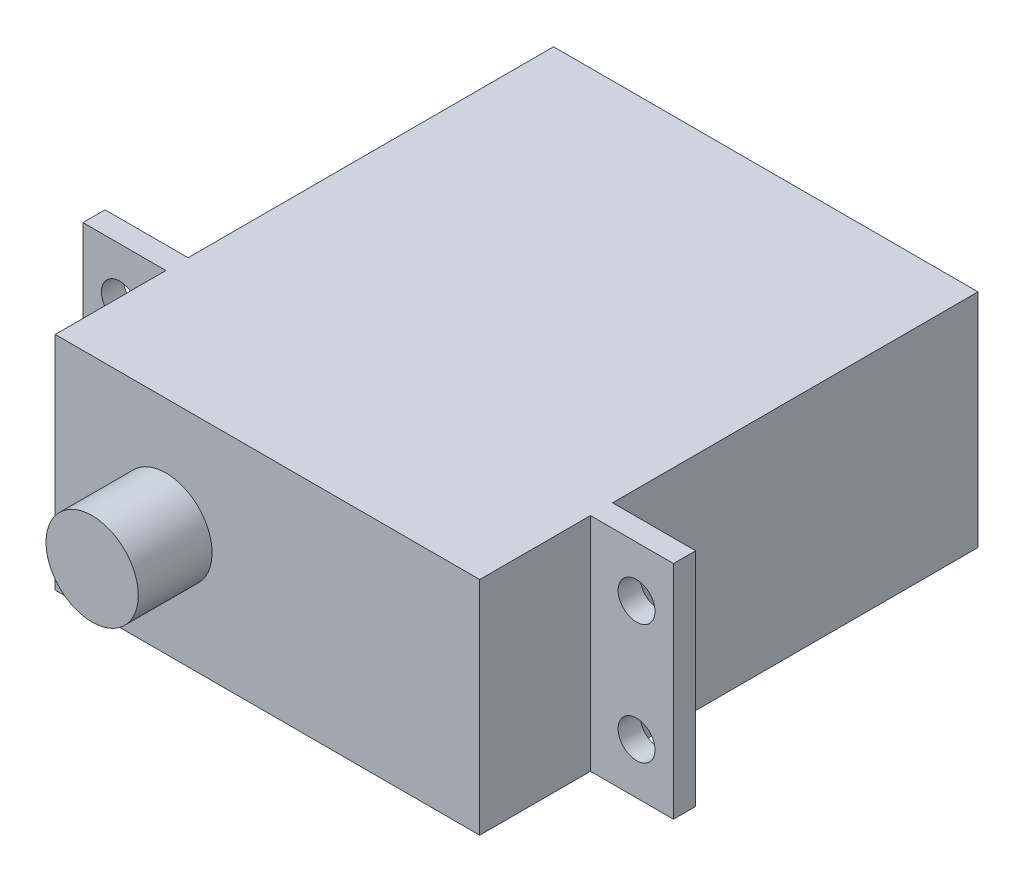
ISO-10303-21;
HEADER;
FILE_DESCRIPTION(('STEP AP214'),'2;1');
FILE_NAME('part.step','',(''),(''),'','','');
FILE_SCHEMA(('AUTOMOTIVE_DESIGN { 1 0 10303 214 1 1 1 1 }'));
ENDSEC;
DATA;
#1=APPLICATION_CONTEXT('core data for automotive mechanical design processes');
#2=APPLICATION_PROTOCOL_DEFINITION('international standard','automotive_design',2000,#1);
#3=PRODUCT_CONTEXT('',#1,'mechanical');
#4=PRODUCT('Part','Part','',(#3));
#5=PRODUCT_RELATED_PRODUCT_CATEGORY('part','',(#4));
#6=PRODUCT_DEFINITION_FORMATION('','',#4);
#7=PRODUCT_DEFINITION_CONTEXT('part definition',#1,'design');
#8=PRODUCT_DEFINITION('design','',#6,#7);
#9=PRODUCT_DEFINITION_SHAPE('','',#8);
#10=(LENGTH_UNIT() NAMED_UNIT(*) SI_UNIT(.MILLI.,.METRE.));
#11=(NAMED_UNIT(*) PLANE_ANGLE_UNIT() SI_UNIT($,.RADIAN.));
#12=(NAMED_UNIT(*) SI_UNIT($,.STERADIAN.) SOLID_ANGLE_UNIT());
#13=UNCERTAINTY_MEASURE_WITH_UNIT(LENGTH_MEASURE(1.E-05),#10,'distance_accuracy_value','');
#14=(GEOMETRIC_REPRESENTATION_CONTEXT(3) GLOBAL_UNCERTAINTY_ASSIGNED_CONTEXT((#13)) GLOBAL_UNIT_ASSIGNED_CONTEXT((#10,
#11,#12)) REPRESENTATION_CONTEXT('',''));
#15=CARTESIAN_POINT('',(0.,0.,0.));
#16=DIRECTION('',(0.,0.,1.));
#17=DIRECTION('',(1.,0.,0.));
#18=AXIS2_PLACEMENT_3D('',#15,#16,#17);
#19=CARTESIAN_POINT('',(11.5,-6.,27.));
#20=DIRECTION('',(-1.,0.,0.));
#21=DIRECTION('',(0.,-1.,0.));
#22=AXIS2_PLACEMENT_3D('',#19,#20,#21);
#23=PLANE('',#22);
#24=DIRECTION('',(0.,1.,0.));
#25=VECTOR('',#24,1.);
#26=CARTESIAN_POINT('',(11.5,-6.,19.8));
#27=LINE('',#26,#25);
#28=CARTESIAN_POINT('',(11.5,-6.,19.8));
#29=VERTEX_POINT('',#28);
#30=CARTESIAN_POINT('',(11.5,6.,19.8));
#31=VERTEX_POINT('',#30);
#32=EDGE_CURVE('E145',#29,#31,#27,.T.);
#33=ORIENTED_EDGE('',*,*,#32,.F.);
#34=DIRECTION('',(0.,0.,-1.));
#35=VECTOR('',#34,1.);
#36=CARTESIAN_POINT('',(11.5,-6.,27.));
#37=LINE('',#36,#35);
#38=CARTESIAN_POINT('',(11.5,-6.,0.));
#39=VERTEX_POINT('',#38);
#40=EDGE_CURVE('E194',#29,#39,#37,.T.);
#41=ORIENTED_EDGE('',*,*,#40,.T.);
#42=DIRECTION('',(0.,1.,0.));
#43=VECTOR('',#42,1.);
#44=CARTESIAN_POINT('',(11.5,-6.,0.));
#45=LINE('',#44,#43);
#46=CARTESIAN_POINT('',(11.5,6.,0.));
#47=VERTEX_POINT('',#46);
#48=EDGE_CURVE('E183',#39,#47,#45,.T.);
#49=ORIENTED_EDGE('',*,*,#48,.T.);
#50=DIRECTION('',(0.,0.,-1.));
#51=VECTOR('',#50,1.);
#52=CARTESIAN_POINT('',(11.5,6.,27.));
#53=LINE('',#52,#51);
#54=EDGE_CURVE('E216',#31,#47,#53,.T.);
#55=ORIENTED_EDGE('',*,*,#54,.F.);
#56=EDGE_LOOP('',(#33,#41,#49,#55));
#57=FACE_BOUND('',#56,.T.);
#58=ADVANCED_FACE('F36',(#57),#23,.F.);
#59=CARTESIAN_POINT('',(-11.5,-6.,27.));
#60=DIRECTION('',(1.,0.,0.));
#61=DIRECTION('',(0.,0.,-1.));
#62=AXIS2_PLACEMENT_3D('',#59,#60,#61);
#63=PLANE('',#62);
#64=DIRECTION('',(0.,-1.,0.));
#65=VECTOR('',#64,1.);
#66=CARTESIAN_POINT('',(-11.5,-6.,19.8));
#67=LINE('',#66,#65);
#68=CARTESIAN_POINT('',(-11.5,6.,19.8));
#69=VERTEX_POINT('',#68);
#70=CARTESIAN_POINT('',(-11.5,-6.,19.8));
#71=VERTEX_POINT('',#70);
#72=EDGE_CURVE('E180',#69,#71,#67,.T.);
#73=ORIENTED_EDGE('',*,*,#72,.F.);
#74=DIRECTION('',(0.,0.,-1.));
#75=VECTOR('',#74,1.);
#76=CARTESIAN_POINT('',(-11.5,6.,27.));
#77=LINE('',#76,#75);
#78=CARTESIAN_POINT('',(-11.5,6.,0.));
#79=VERTEX_POINT('',#78);
#80=EDGE_CURVE('E212',#69,#79,#77,.T.);
#81=ORIENTED_EDGE('',*,*,#80,.T.);
#82=DIRECTION('',(0.,-1.,0.));
#83=VECTOR('',#82,1.);
#84=CARTESIAN_POINT('',(-11.5,-6.,0.));
#85=LINE('',#84,#83);
#86=CARTESIAN_POINT('',(-11.5,-6.,0.));
#87=VERTEX_POINT('',#86);
#88=EDGE_CURVE('E200',#79,#87,#85,.T.);
#89=ORIENTED_EDGE('',*,*,#88,.T.);
#90=DIRECTION('',(0.,0.,-1.));
#91=VECTOR('',#90,1.);
#92=CARTESIAN_POINT('',(-11.5,-6.,27.));
#93=LINE('',#92,#91);
#94=EDGE_CURVE('E208',#71,#87,#93,.T.);
#95=ORIENTED_EDGE('',*,*,#94,.F.);
#96=EDGE_LOOP('',(#73,#81,#89,#95));
#97=FACE_BOUND('',#96,.T.);
#98=ADVANCED_FACE('F279',(#97),#63,.F.);
#99=CARTESIAN_POINT('',(11.5,-6.,27.));
#100=VERTEX_POINT('',#99);
#101=CARTESIAN_POINT('',(11.5,-6.,21.));
#102=VERTEX_POINT('',#101);
#103=EDGE_CURVE('E205',#100,#102,#37,.T.);
#104=ORIENTED_EDGE('',*,*,#103,.T.);
#105=DIRECTION('',(0.,1.,0.));
#106=VECTOR('',#105,1.);
#107=CARTESIAN_POINT('',(11.5,-6.,21.));
#108=LINE('',#107,#106);
#109=CARTESIAN_POINT('',(11.5,6.,21.));
#110=VERTEX_POINT('',#109);
#111=EDGE_CURVE('E178',#102,#110,#108,.T.);
#112=ORIENTED_EDGE('',*,*,#111,.T.);
#113=CARTESIAN_POINT('',(11.5,6.,27.));
#114=VERTEX_POINT('',#113);
#115=EDGE_CURVE('E45',#114,#110,#53,.T.);
#116=ORIENTED_EDGE('',*,*,#115,.F.);
#117=DIRECTION('',(0.,1.,0.));
#118=VECTOR('',#117,1.);
#119=CARTESIAN_POINT('',(11.5,-6.,27.));
#120=LINE('',#119,#118);
#121=EDGE_CURVE('E184',#100,#114,#120,.T.);
#122=ORIENTED_EDGE('',*,*,#121,.F.);
#123=EDGE_LOOP('',(#104,#112,#116,#122));
#124=FACE_BOUND('',#123,.T.);
#125=ADVANCED_FACE('F38',(#124),#23,.F.);
#126=CARTESIAN_POINT('',(-11.5,6.,27.));
#127=DIRECTION('',(0.,-1.,0.));
#128=DIRECTION('',(0.,0.,-1.));
#129=AXIS2_PLACEMENT_3D('',#126,#127,#128);
#130=PLANE('',#129);
#131=ORIENTED_EDGE('',*,*,#115,.T.);
#132=DIRECTION('',(-1.,0.,0.));
#133=VECTOR('',#132,1.);
#134=CARTESIAN_POINT('',(-16.,6.,21.));
#135=LINE('',#134,#133);
#136=CARTESIAN_POINT('',(16.,6.,21.));
#137=VERTEX_POINT('',#136);
#138=EDGE_CURVE('E53',#137,#110,#135,.T.);
#139=ORIENTED_EDGE('',*,*,#138,.F.);
#140=DIRECTION('',(0.,0.,1.));
#141=VECTOR('',#140,1.);
#142=CARTESIAN_POINT('',(16.,6.,19.8));
#143=LINE('',#142,#141);
#144=CARTESIAN_POINT('',(16.,6.,19.8));
#145=VERTEX_POINT('',#144);
#146=EDGE_CURVE('E128',#145,#137,#143,.T.);
#147=ORIENTED_EDGE('',*,*,#146,.F.);
#148=DIRECTION('',(-1.,0.,0.));
#149=VECTOR('',#148,1.);
#150=CARTESIAN_POINT('',(-16.,6.,19.8));
#151=LINE('',#150,#149);
#152=EDGE_CURVE('E132',#145,#31,#151,.T.);
#153=ORIENTED_EDGE('',*,*,#152,.T.);
#154=ORIENTED_EDGE('',*,*,#54,.T.);
#155=DIRECTION('',(-1.,0.,0.));
#156=VECTOR('',#155,1.);
#157=CARTESIAN_POINT('',(-11.5,6.,0.));
#158=LINE('',#157,#156);
#159=EDGE_CURVE('E197',#47,#79,#158,.T.);
#160=ORIENTED_EDGE('',*,*,#159,.T.);
#161=ORIENTED_EDGE('',*,*,#80,.F.);
#162=CARTESIAN_POINT('',(-16.,6.,19.8));
#163=VERTEX_POINT('',#162);
#164=EDGE_CURVE('E147',#69,#163,#151,.T.);
#165=ORIENTED_EDGE('',*,*,#164,.T.);
#166=DIRECTION('',(0.,0.,1.));
#167=VECTOR('',#166,1.);
#168=CARTESIAN_POINT('',(-16.,6.,19.8));
#169=LINE('',#168,#167);
#170=CARTESIAN_POINT('',(-16.,6.,21.));
#171=VERTEX_POINT('',#170);
#172=EDGE_CURVE('E137',#163,#171,#169,.T.);
#173=ORIENTED_EDGE('',*,*,#172,.T.);
#174=CARTESIAN_POINT('',(-11.5,6.,21.));
#175=VERTEX_POINT('',#174);
#176=EDGE_CURVE('E167',#175,#171,#135,.T.);
#177=ORIENTED_EDGE('',*,*,#176,.F.);
#178=CARTESIAN_POINT('',(-11.5,6.,27.));
#179=VERTEX_POINT('',#178);
#180=EDGE_CURVE('E213',#179,#175,#77,.T.);
#181=ORIENTED_EDGE('',*,*,#180,.F.);
#182=DIRECTION('',(-1.,0.,0.));
#183=VECTOR('',#182,1.);
#184=CARTESIAN_POINT('',(-11.5,6.,27.));
#185=LINE('',#184,#183);
#186=EDGE_CURVE('E187',#114,#179,#185,.T.);
#187=ORIENTED_EDGE('',*,*,#186,.F.);
#188=EDGE_LOOP('',(#131,#139,#147,#153,#154,#160,#161,#165,#173,#177,#181,#187));
#189=FACE_BOUND('',#188,.T.);
#190=ADVANCED_FACE('F131',(#189),#130,.F.);
#191=ORIENTED_EDGE('',*,*,#180,.T.);
#192=DIRECTION('',(0.,-1.,0.));
#193=VECTOR('',#192,1.);
#194=CARTESIAN_POINT('',(-11.5,-6.,21.));
#195=LINE('',#194,#193);
#196=CARTESIAN_POINT('',(-11.5,-6.,21.));
#197=VERTEX_POINT('',#196);
#198=EDGE_CURVE('E172',#175,#197,#195,.T.);
#199=ORIENTED_EDGE('',*,*,#198,.T.);
#200=CARTESIAN_POINT('',(-11.5,-6.,27.));
#201=VERTEX_POINT('',#200);
#202=EDGE_CURVE('E209',#201,#197,#93,.T.);
#203=ORIENTED_EDGE('',*,*,#202,.F.);
#204=DIRECTION('',(0.,-1.,0.));
#205=VECTOR('',#204,1.);
#206=CARTESIAN_POINT('',(-11.5,-6.,27.));
#207=LINE('',#206,#205);
#208=EDGE_CURVE('E190',#179,#201,#207,.T.);
#209=ORIENTED_EDGE('',*,*,#208,.F.);
#210=EDGE_LOOP('',(#191,#199,#203,#209));
#211=FACE_BOUND('',#210,.T.);
#212=ADVANCED_FACE('F266',(#211),#63,.F.);
#213=CARTESIAN_POINT('',(-11.5,-6.,27.));
#214=DIRECTION('',(0.,1.,0.));
#215=DIRECTION('',(0.,0.,1.));
#216=AXIS2_PLACEMENT_3D('',#213,#214,#215);
#217=PLANE('',#216);
#218=ORIENTED_EDGE('',*,*,#202,.T.);
#219=DIRECTION('',(1.,0.,0.));
#220=VECTOR('',#219,1.);
#221=CARTESIAN_POINT('',(-16.,-6.,21.));
#222=LINE('',#221,#220);
#223=CARTESIAN_POINT('',(-16.,-6.,21.));
#224=VERTEX_POINT('',#223);
#225=EDGE_CURVE('E61',#224,#197,#222,.T.);
#226=ORIENTED_EDGE('',*,*,#225,.F.);
#227=DIRECTION('',(0.,0.,1.));
#228=VECTOR('',#227,1.);
#229=CARTESIAN_POINT('',(-16.,-6.,19.8));
#230=LINE('',#229,#228);
#231=CARTESIAN_POINT('',(-16.,-6.,19.8));
#232=VERTEX_POINT('',#231);
#233=EDGE_CURVE('E173',#232,#224,#230,.T.);
#234=ORIENTED_EDGE('',*,*,#233,.F.);
#235=DIRECTION('',(1.,0.,0.));
#236=VECTOR('',#235,1.);
#237=CARTESIAN_POINT('',(-16.,-6.,19.8));
#238=LINE('',#237,#236);
#239=EDGE_CURVE('E138',#232,#71,#238,.T.);
#240=ORIENTED_EDGE('',*,*,#239,.T.);
#241=ORIENTED_EDGE('',*,*,#94,.T.);
#242=DIRECTION('',(1.,0.,0.));
#243=VECTOR('',#242,1.);
#244=CARTESIAN_POINT('',(-11.5,-6.,0.));
#245=LINE('',#244,#243);
#246=EDGE_CURVE('E188',#87,#39,#245,.T.);
#247=ORIENTED_EDGE('',*,*,#246,.T.);
#248=ORIENTED_EDGE('',*,*,#40,.F.);
#249=CARTESIAN_POINT('',(16.,-6.,19.8));
#250=VERTEX_POINT('',#249);
#251=EDGE_CURVE('E162',#29,#250,#238,.T.);
#252=ORIENTED_EDGE('',*,*,#251,.T.);
#253=DIRECTION('',(0.,0.,1.));
#254=VECTOR('',#253,1.);
#255=CARTESIAN_POINT('',(16.,-6.,19.8));
#256=LINE('',#255,#254);
#257=CARTESIAN_POINT('',(16.,-6.,21.));
#258=VERTEX_POINT('',#257);
#259=EDGE_CURVE('E152',#250,#258,#256,.T.);
#260=ORIENTED_EDGE('',*,*,#259,.T.);
#261=EDGE_CURVE('E154',#102,#258,#222,.T.);
#262=ORIENTED_EDGE('',*,*,#261,.F.);
#263=ORIENTED_EDGE('',*,*,#103,.F.);
#264=DIRECTION('',(1.,0.,0.));
#265=VECTOR('',#264,1.);
#266=CARTESIAN_POINT('',(-11.5,-6.,27.));
#267=LINE('',#266,#265);
#268=EDGE_CURVE('E192',#201,#100,#267,.T.);
#269=ORIENTED_EDGE('',*,*,#268,.F.);
#270=EDGE_LOOP('',(#218,#226,#234,#240,#241,#247,#248,#252,#260,#262,#263,#269));
#271=FACE_BOUND('',#270,.T.);
#272=ADVANCED_FACE('F257',(#271),#217,.F.);
#273=CARTESIAN_POINT('',(0.,0.,27.));
#274=DIRECTION('',(0.,0.,-1.));
#275=DIRECTION('',(-1.,0.,0.));
#276=AXIS2_PLACEMENT_3D('',#273,#274,#275);
#277=PLANE('',#276);
#278=CARTESIAN_POINT('',(-5.5,0.,27.));
#279=DIRECTION('',(0.,0.,-1.));
#280=DIRECTION('',(-1.,0.,0.));
#281=AXIS2_PLACEMENT_3D('',#278,#279,#280);
#282=CIRCLE('',#281,2.5);
#283=CARTESIAN_POINT('',(-8.,0.,27.));
#284=VERTEX_POINT('',#283);
#285=EDGE_CURVE('E11',#284,#284,#282,.F.);
#286=ORIENTED_EDGE('',*,*,#285,.F.);
#287=EDGE_LOOP('',(#286));
#288=FACE_BOUND('',#287,.T.);
#289=ORIENTED_EDGE('',*,*,#121,.T.);
#290=ORIENTED_EDGE('',*,*,#186,.T.);
#291=ORIENTED_EDGE('',*,*,#208,.T.);
#292=ORIENTED_EDGE('',*,*,#268,.T.);
#293=EDGE_LOOP('',(#289,#290,#291,#292));
#294=FACE_BOUND('',#293,.T.);
#295=ADVANCED_FACE('F261',(#288,#294),#277,.F.);
#296=CARTESIAN_POINT('',(0.,0.,0.));
#297=DIRECTION('',(0.,0.,-1.));
#298=DIRECTION('',(-1.,0.,0.));
#299=AXIS2_PLACEMENT_3D('',#296,#297,#298);
#300=PLANE('',#299);
#301=ORIENTED_EDGE('',*,*,#48,.F.);
#302=ORIENTED_EDGE('',*,*,#246,.F.);
#303=ORIENTED_EDGE('',*,*,#88,.F.);
#304=ORIENTED_EDGE('',*,*,#159,.F.);
#305=EDGE_LOOP('',(#301,#302,#303,#304));
#306=FACE_BOUND('',#305,.T.);
#307=ADVANCED_FACE('F285',(#306),#300,.T.);
#308=CARTESIAN_POINT('',(-16.,6.,19.8));
#309=DIRECTION('',(-1.,0.,0.));
#310=DIRECTION('',(0.,0.,1.));
#311=AXIS2_PLACEMENT_3D('',#308,#309,#310);
#312=PLANE('',#311);
#313=DIRECTION('',(0.,-1.,0.));
#314=VECTOR('',#313,1.);
#315=CARTESIAN_POINT('',(-16.,6.,21.));
#316=LINE('',#315,#314);
#317=EDGE_CURVE('E169',#171,#224,#316,.T.);
#318=ORIENTED_EDGE('',*,*,#317,.F.);
#319=ORIENTED_EDGE('',*,*,#172,.F.);
#320=DIRECTION('',(0.,-1.,0.));
#321=VECTOR('',#320,1.);
#322=CARTESIAN_POINT('',(-16.,6.,19.8));
#323=LINE('',#322,#321);
#324=EDGE_CURVE('E146',#163,#232,#323,.T.);
#325=ORIENTED_EDGE('',*,*,#324,.T.);
#326=ORIENTED_EDGE('',*,*,#233,.T.);
#327=EDGE_LOOP('',(#318,#319,#325,#326));
#328=FACE_BOUND('',#327,.T.);
#329=ADVANCED_FACE('F273',(#328),#312,.T.);
#330=CARTESIAN_POINT('',(0.,0.,21.));
#331=DIRECTION('',(0.,0.,1.));
#332=DIRECTION('',(1.,0.,0.));
#333=AXIS2_PLACEMENT_3D('',#330,#331,#332);
#334=PLANE('',#333);
#335=CARTESIAN_POINT('',(-14.,3.25,21.));
#336=DIRECTION('',(0.,0.,1.));
#337=DIRECTION('',(-1.,0.,0.));
#338=AXIS2_PLACEMENT_3D('',#335,#336,#337);
#339=CIRCLE('',#338,1.);
#340=CARTESIAN_POINT('',(-15.,3.25,21.));
#341=VERTEX_POINT('',#340);
#342=EDGE_CURVE('E234',#341,#341,#339,.T.);
#343=ORIENTED_EDGE('',*,*,#342,.F.);
#344=EDGE_LOOP('',(#343));
#345=FACE_BOUND('',#344,.T.);
#346=CARTESIAN_POINT('',(-14.,-3.25,21.));
#347=DIRECTION('',(0.,0.,1.));
#348=DIRECTION('',(1.,0.,0.));
#349=AXIS2_PLACEMENT_3D('',#346,#347,#348);
#350=CIRCLE('',#349,1.);
#351=CARTESIAN_POINT('',(-13.,-3.25,21.));
#352=VERTEX_POINT('',#351);
#353=EDGE_CURVE('E237',#352,#352,#350,.T.);
#354=ORIENTED_EDGE('',*,*,#353,.F.);
#355=EDGE_LOOP('',(#354));
#356=FACE_BOUND('',#355,.T.);
#357=ORIENTED_EDGE('',*,*,#198,.F.);
#358=ORIENTED_EDGE('',*,*,#176,.T.);
#359=ORIENTED_EDGE('',*,*,#317,.T.);
#360=ORIENTED_EDGE('',*,*,#225,.T.);
#361=EDGE_LOOP('',(#357,#358,#359,#360));
#362=FACE_BOUND('',#361,.T.);
#363=ADVANCED_FACE('F250',(#345,#356,#362),#334,.T.);
#364=CARTESIAN_POINT('',(0.,0.,19.8));
#365=DIRECTION('',(0.,0.,1.));
#366=DIRECTION('',(1.,0.,0.));
#367=AXIS2_PLACEMENT_3D('',#364,#365,#366);
#368=PLANE('',#367);
#369=CARTESIAN_POINT('',(-14.,3.25,19.8));
#370=DIRECTION('',(0.,0.,1.));
#371=DIRECTION('',(1.,0.,0.));
#372=AXIS2_PLACEMENT_3D('',#369,#370,#371);
#373=CIRCLE('',#372,1.);
#374=CARTESIAN_POINT('',(-13.,3.25,19.8));
#375=VERTEX_POINT('',#374);
#376=EDGE_CURVE('E40',#375,#375,#373,.T.);
#377=ORIENTED_EDGE('',*,*,#376,.T.);
#378=EDGE_LOOP('',(#377));
#379=FACE_BOUND('',#378,.T.);
#380=CARTESIAN_POINT('',(-14.,-3.25,19.8));
#381=DIRECTION('',(0.,0.,1.));
#382=DIRECTION('',(1.,0.,0.));
#383=AXIS2_PLACEMENT_3D('',#380,#381,#382);
#384=CIRCLE('',#383,1.);
#385=CARTESIAN_POINT('',(-13.,-3.25,19.8));
#386=VERTEX_POINT('',#385);
#387=EDGE_CURVE('E217',#386,#386,#384,.T.);
#388=ORIENTED_EDGE('',*,*,#387,.T.);
#389=EDGE_LOOP('',(#388));
#390=FACE_BOUND('',#389,.T.);
#391=ORIENTED_EDGE('',*,*,#164,.F.);
#392=ORIENTED_EDGE('',*,*,#72,.T.);
#393=ORIENTED_EDGE('',*,*,#239,.F.);
#394=ORIENTED_EDGE('',*,*,#324,.F.);
#395=EDGE_LOOP('',(#391,#392,#393,#394));
#396=FACE_BOUND('',#395,.T.);
#397=ADVANCED_FACE('F315',(#379,#390,#396),#368,.F.);
#398=CARTESIAN_POINT('',(14.,-3.25,19.8));
#399=DIRECTION('',(0.,0.,1.));
#400=DIRECTION('',(1.,0.,0.));
#401=AXIS2_PLACEMENT_3D('',#398,#399,#400);
#402=CIRCLE('',#401,1.);
#403=CARTESIAN_POINT('',(15.,-3.25,19.8));
#404=VERTEX_POINT('',#403);
#405=EDGE_CURVE('E219',#404,#404,#402,.T.);
#406=ORIENTED_EDGE('',*,*,#405,.T.);
#407=EDGE_LOOP('',(#406));
#408=FACE_BOUND('',#407,.T.);
#409=CARTESIAN_POINT('',(14.,3.25,19.8));
#410=DIRECTION('',(0.,0.,1.));
#411=DIRECTION('',(1.,0.,0.));
#412=AXIS2_PLACEMENT_3D('',#409,#410,#411);
#413=CIRCLE('',#412,1.);
#414=CARTESIAN_POINT('',(15.,3.25,19.8));
#415=VERTEX_POINT('',#414);
#416=EDGE_CURVE('E224',#415,#415,#413,.T.);
#417=ORIENTED_EDGE('',*,*,#416,.T.);
#418=EDGE_LOOP('',(#417));
#419=FACE_BOUND('',#418,.T.);
#420=ORIENTED_EDGE('',*,*,#251,.F.);
#421=ORIENTED_EDGE('',*,*,#32,.T.);
#422=ORIENTED_EDGE('',*,*,#152,.F.);
#423=DIRECTION('',(0.,1.,0.));
#424=VECTOR('',#423,1.);
#425=CARTESIAN_POINT('',(16.,6.,19.8));
#426=LINE('',#425,#424);
#427=EDGE_CURVE('E143',#250,#145,#426,.T.);
#428=ORIENTED_EDGE('',*,*,#427,.F.);
#429=EDGE_LOOP('',(#420,#421,#422,#428));
#430=FACE_BOUND('',#429,.T.);
#431=ADVANCED_FACE('F142',(#408,#419,#430),#368,.F.);
#432=CARTESIAN_POINT('',(14.,-3.25,21.));
#433=DIRECTION('',(0.,0.,1.));
#434=DIRECTION('',(-1.,0.,0.));
#435=AXIS2_PLACEMENT_3D('',#432,#433,#434);
#436=CIRCLE('',#435,1.);
#437=CARTESIAN_POINT('',(13.,-3.25,21.));
#438=VERTEX_POINT('',#437);
#439=EDGE_CURVE('E233',#438,#438,#436,.T.);
#440=ORIENTED_EDGE('',*,*,#439,.F.);
#441=EDGE_LOOP('',(#440));
#442=FACE_BOUND('',#441,.T.);
#443=CARTESIAN_POINT('',(14.,3.25,21.));
#444=DIRECTION('',(0.,0.,1.));
#445=DIRECTION('',(1.,0.,0.));
#446=AXIS2_PLACEMENT_3D('',#443,#444,#445);
#447=CIRCLE('',#446,1.);
#448=CARTESIAN_POINT('',(15.,3.25,21.));
#449=VERTEX_POINT('',#448);
#450=EDGE_CURVE('E228',#449,#449,#447,.T.);
#451=ORIENTED_EDGE('',*,*,#450,.F.);
#452=EDGE_LOOP('',(#451));
#453=FACE_BOUND('',#452,.T.);
#454=ORIENTED_EDGE('',*,*,#111,.F.);
#455=ORIENTED_EDGE('',*,*,#261,.T.);
#456=DIRECTION('',(0.,1.,0.));
#457=VECTOR('',#456,1.);
#458=CARTESIAN_POINT('',(16.,6.,21.));
#459=LINE('',#458,#457);
#460=EDGE_CURVE('E165',#258,#137,#459,.T.);
#461=ORIENTED_EDGE('',*,*,#460,.T.);
#462=ORIENTED_EDGE('',*,*,#138,.T.);
#463=EDGE_LOOP('',(#454,#455,#461,#462));
#464=FACE_BOUND('',#463,.T.);
#465=ADVANCED_FACE('F246',(#442,#453,#464),#334,.T.);
#466=CARTESIAN_POINT('',(16.,6.,19.8));
#467=DIRECTION('',(1.,0.,0.));
#468=DIRECTION('',(0.,0.,-1.));
#469=AXIS2_PLACEMENT_3D('',#466,#467,#468);
#470=PLANE('',#469);
#471=ORIENTED_EDGE('',*,*,#460,.F.);
#472=ORIENTED_EDGE('',*,*,#259,.F.);
#473=ORIENTED_EDGE('',*,*,#427,.T.);
#474=ORIENTED_EDGE('',*,*,#146,.T.);
#475=EDGE_LOOP('',(#471,#472,#473,#474));
#476=FACE_BOUND('',#475,.T.);
#477=ADVANCED_FACE('F150',(#476),#470,.T.);
#478=CARTESIAN_POINT('',(-5.5,0.,31.));
#479=DIRECTION('',(0.,0.,-1.));
#480=DIRECTION('',(-1.,0.,0.));
#481=AXIS2_PLACEMENT_3D('',#478,#479,#480);
#482=CYLINDRICAL_SURFACE('',#481,2.5);
#483=CARTESIAN_POINT('',(-5.5,0.,31.));
#484=DIRECTION('',(0.,0.,1.));
#485=DIRECTION('',(1.,0.,0.));
#486=AXIS2_PLACEMENT_3D('',#483,#484,#485);
#487=CIRCLE('',#486,2.5);
#488=CARTESIAN_POINT('',(-3.,0.,31.));
#489=VERTEX_POINT('',#488);
#490=EDGE_CURVE('E157',#489,#489,#487,.T.);
#491=ORIENTED_EDGE('',*,*,#490,.F.);
#492=EDGE_LOOP('',(#491));
#493=FACE_BOUND('',#492,.T.);
#494=ORIENTED_EDGE('',*,*,#285,.T.);
#495=EDGE_LOOP('',(#494));
#496=FACE_BOUND('',#495,.T.);
#497=ADVANCED_FACE('F310',(#493,#496),#482,.T.);
#498=CARTESIAN_POINT('',(-5.5,0.,31.));
#499=DIRECTION('',(0.,0.,1.));
#500=DIRECTION('',(1.,0.,0.));
#501=AXIS2_PLACEMENT_3D('',#498,#499,#500);
#502=PLANE('',#501);
#503=ORIENTED_EDGE('',*,*,#490,.T.);
#504=EDGE_LOOP('',(#503));
#505=FACE_BOUND('',#504,.T.);
#506=ADVANCED_FACE('F318',(#505),#502,.T.);
#507=CARTESIAN_POINT('',(14.,3.25,17.));
#508=DIRECTION('',(0.,0.,1.));
#509=DIRECTION('',(1.,0.,0.));
#510=AXIS2_PLACEMENT_3D('',#507,#508,#509);
#511=CYLINDRICAL_SURFACE('',#510,1.);
#512=ORIENTED_EDGE('',*,*,#450,.T.);
#513=EDGE_LOOP('',(#512));
#514=FACE_BOUND('',#513,.T.);
#515=ORIENTED_EDGE('',*,*,#416,.F.);
#516=EDGE_LOOP('',(#515));
#517=FACE_BOUND('',#516,.T.);
#518=ADVANCED_FACE('F322',(#514,#517),#511,.F.);
#519=CARTESIAN_POINT('',(14.,-3.25,17.));
#520=DIRECTION('',(0.,0.,1.));
#521=DIRECTION('',(1.,0.,0.));
#522=AXIS2_PLACEMENT_3D('',#519,#520,#521);
#523=CYLINDRICAL_SURFACE('',#522,1.);
#524=ORIENTED_EDGE('',*,*,#439,.T.);
#525=EDGE_LOOP('',(#524));
#526=FACE_BOUND('',#525,.T.);
#527=ORIENTED_EDGE('',*,*,#405,.F.);
#528=EDGE_LOOP('',(#527));
#529=FACE_BOUND('',#528,.T.);
#530=ADVANCED_FACE('F243',(#526,#529),#523,.F.);
#531=CARTESIAN_POINT('',(-14.,-3.25,17.));
#532=DIRECTION('',(0.,0.,1.));
#533=DIRECTION('',(1.,0.,0.));
#534=AXIS2_PLACEMENT_3D('',#531,#532,#533);
#535=CYLINDRICAL_SURFACE('',#534,1.);
#536=ORIENTED_EDGE('',*,*,#353,.T.);
#537=EDGE_LOOP('',(#536));
#538=FACE_BOUND('',#537,.T.);
#539=ORIENTED_EDGE('',*,*,#387,.F.);
#540=EDGE_LOOP('',(#539));
#541=FACE_BOUND('',#540,.T.);
#542=ADVANCED_FACE('F330',(#538,#541),#535,.F.);
#543=CARTESIAN_POINT('',(-14.,3.25,17.));
#544=DIRECTION('',(0.,0.,1.));
#545=DIRECTION('',(1.,0.,0.));
#546=AXIS2_PLACEMENT_3D('',#543,#544,#545);
#547=CYLINDRICAL_SURFACE('',#546,1.);
#548=ORIENTED_EDGE('',*,*,#342,.T.);
#549=EDGE_LOOP('',(#548));
#550=FACE_BOUND('',#549,.T.);
#551=ORIENTED_EDGE('',*,*,#376,.F.);
#552=EDGE_LOOP('',(#551));
#553=FACE_BOUND('',#552,.T.);
#554=ADVANCED_FACE('F327',(#550,#553),#547,.F.);
#555=CLOSED_SHELL('',(#58,#98,#125,#190,#212,#272,#295,#307,#329,#363,#397,#431,#465,#477,#497,
#506,#518,#530,#542,#554));
#556=MANIFOLD_SOLID_BREP('B2',#555);
#557=ADVANCED_BREP_SHAPE_REPRESENTATION('',(#18,#556),#14);
#558=SHAPE_DEFINITION_REPRESENTATION(#9,#557);
ENDSEC;
END-ISO-10303-21;
